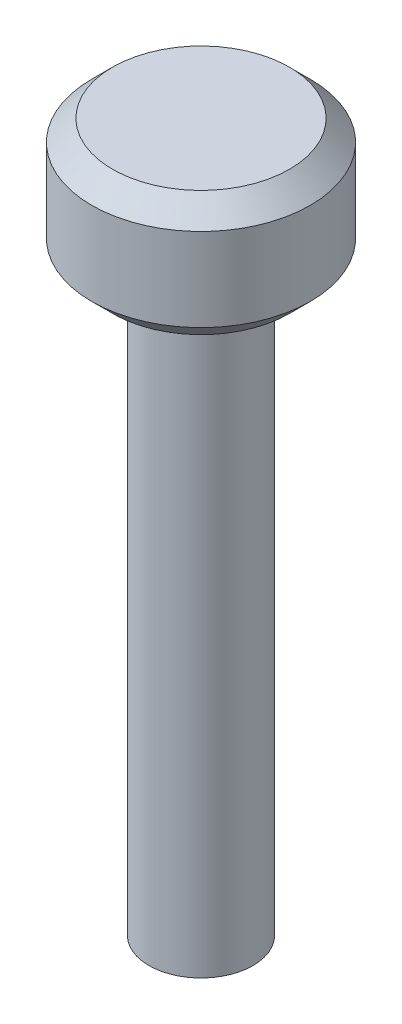
ISO-10303-21;
HEADER;
FILE_DESCRIPTION(('STEP AP214'),'2;1');
FILE_NAME('part.step','',(''),(''),'','','');
FILE_SCHEMA(('AUTOMOTIVE_DESIGN { 1 0 10303 214 1 1 1 1 }'));
ENDSEC;
DATA;
#1=APPLICATION_CONTEXT('core data for automotive mechanical design processes');
#2=APPLICATION_PROTOCOL_DEFINITION('international standard','automotive_design',2000,#1);
#3=PRODUCT_CONTEXT('',#1,'mechanical');
#4=PRODUCT('Part','Part','',(#3));
#5=PRODUCT_RELATED_PRODUCT_CATEGORY('part','',(#4));
#6=PRODUCT_DEFINITION_FORMATION('','',#4);
#7=PRODUCT_DEFINITION_CONTEXT('part definition',#1,'design');
#8=PRODUCT_DEFINITION('design','',#6,#7);
#9=PRODUCT_DEFINITION_SHAPE('','',#8);
#10=(LENGTH_UNIT() NAMED_UNIT(*) SI_UNIT(.MILLI.,.METRE.));
#11=(NAMED_UNIT(*) PLANE_ANGLE_UNIT() SI_UNIT($,.RADIAN.));
#12=(NAMED_UNIT(*) SI_UNIT($,.STERADIAN.) SOLID_ANGLE_UNIT());
#13=UNCERTAINTY_MEASURE_WITH_UNIT(LENGTH_MEASURE(1.E-05),#10,'distance_accuracy_value','');
#14=(GEOMETRIC_REPRESENTATION_CONTEXT(3) GLOBAL_UNCERTAINTY_ASSIGNED_CONTEXT((#13)) GLOBAL_UNIT_ASSIGNED_CONTEXT((#10,
#11,#12)) REPRESENTATION_CONTEXT('',''));
#15=CARTESIAN_POINT('',(0.,0.,0.));
#16=DIRECTION('',(0.,0.,1.));
#17=DIRECTION('',(1.,0.,0.));
#18=AXIS2_PLACEMENT_3D('',#15,#16,#17);
#19=CARTESIAN_POINT('',(0.,34.,0.));
#20=DIRECTION('',(0.,-1.,0.));
#21=DIRECTION('',(1.,0.,0.));
#22=AXIS2_PLACEMENT_3D('',#19,#20,#21);
#23=PLANE('',#22);
#24=CARTESIAN_POINT('',(0.,34.,0.));
#25=DIRECTION('',(0.,-1.,0.));
#26=DIRECTION('',(1.,0.,0.));
#27=AXIS2_PLACEMENT_3D('',#24,#25,#26);
#28=CIRCLE('',#27,4.25);
#29=CARTESIAN_POINT('',(4.25000000000001,34.,0.));
#30=VERTEX_POINT('',#29);
#31=EDGE_CURVE('E11',#30,#30,#28,.T.);
#32=ORIENTED_EDGE('',*,*,#31,.F.);
#33=EDGE_LOOP('',(#32));
#34=FACE_BOUND('',#33,.T.);
#35=ADVANCED_FACE('F43',(#34),#23,.F.);
#36=CARTESIAN_POINT('',(0.,34.,0.));
#37=DIRECTION('',(0.,-1.,0.));
#38=DIRECTION('',(1.,0.,0.));
#39=AXIS2_PLACEMENT_3D('',#36,#37,#38);
#40=CONICAL_SURFACE('',#39,4.25,0.785398163397448);
#41=CARTESIAN_POINT('',(0.,33.,0.));
#42=DIRECTION('',(0.,-1.,0.));
#43=DIRECTION('',(1.,0.,0.));
#44=AXIS2_PLACEMENT_3D('',#41,#42,#43);
#45=CIRCLE('',#44,5.25);
#46=CARTESIAN_POINT('',(5.25000000000001,33.,0.));
#47=VERTEX_POINT('',#46);
#48=EDGE_CURVE('E49',#47,#47,#45,.T.);
#49=ORIENTED_EDGE('',*,*,#48,.F.);
#50=EDGE_LOOP('',(#49));
#51=FACE_BOUND('',#50,.T.);
#52=ORIENTED_EDGE('',*,*,#31,.T.);
#53=EDGE_LOOP('',(#52));
#54=FACE_BOUND('',#53,.T.);
#55=ADVANCED_FACE('F76',(#51,#54),#40,.T.);
#56=CARTESIAN_POINT('',(0.,0.295692583709366,0.));
#57=DIRECTION('',(0.,-1.,0.));
#58=DIRECTION('',(1.,0.,0.));
#59=AXIS2_PLACEMENT_3D('',#56,#57,#58);
#60=CYLINDRICAL_SURFACE('',#59,5.25);
#61=CARTESIAN_POINT('',(0.,29.,0.));
#62=DIRECTION('',(0.,-1.,0.));
#63=DIRECTION('',(1.,0.,0.));
#64=AXIS2_PLACEMENT_3D('',#61,#62,#63);
#65=CIRCLE('',#64,5.25);
#66=CARTESIAN_POINT('',(5.25,29.,0.));
#67=VERTEX_POINT('',#66);
#68=EDGE_CURVE('E69',#67,#67,#65,.T.);
#69=ORIENTED_EDGE('',*,*,#68,.F.);
#70=EDGE_LOOP('',(#69));
#71=FACE_BOUND('',#70,.T.);
#72=ORIENTED_EDGE('',*,*,#48,.T.);
#73=EDGE_LOOP('',(#72));
#74=FACE_BOUND('',#73,.T.);
#75=ADVANCED_FACE('F74',(#71,#74),#60,.T.);
#76=CARTESIAN_POINT('',(0.,29.,0.));
#77=DIRECTION('',(0.,1.,0.));
#78=DIRECTION('',(-1.,0.,0.));
#79=AXIS2_PLACEMENT_3D('',#76,#77,#78);
#80=CONICAL_SURFACE('',#79,5.25,0.785398163397448);
#81=CARTESIAN_POINT('',(0.,28.,0.));
#82=DIRECTION('',(0.,-1.,0.));
#83=DIRECTION('',(1.,0.,0.));
#84=AXIS2_PLACEMENT_3D('',#81,#82,#83);
#85=CIRCLE('',#84,4.25);
#86=CARTESIAN_POINT('',(4.25,28.,0.));
#87=VERTEX_POINT('',#86);
#88=EDGE_CURVE('E64',#87,#87,#85,.T.);
#89=ORIENTED_EDGE('',*,*,#88,.F.);
#90=EDGE_LOOP('',(#89));
#91=FACE_BOUND('',#90,.T.);
#92=ORIENTED_EDGE('',*,*,#68,.T.);
#93=EDGE_LOOP('',(#92));
#94=FACE_BOUND('',#93,.T.);
#95=ADVANCED_FACE('F96',(#91,#94),#80,.T.);
#96=CARTESIAN_POINT('',(-4.25,28.,0.));
#97=DIRECTION('',(0.,1.,0.));
#98=DIRECTION('',(-1.,0.,0.));
#99=AXIS2_PLACEMENT_3D('',#96,#97,#98);
#100=PLANE('',#99);
#101=CARTESIAN_POINT('',(0.,28.,0.));
#102=DIRECTION('',(0.,-1.,0.));
#103=DIRECTION('',(1.,0.,0.));
#104=AXIS2_PLACEMENT_3D('',#101,#102,#103);
#105=CIRCLE('',#104,2.5);
#106=CARTESIAN_POINT('',(2.5,28.,0.));
#107=VERTEX_POINT('',#106);
#108=EDGE_CURVE('E61',#107,#107,#105,.T.);
#109=ORIENTED_EDGE('',*,*,#108,.F.);
#110=EDGE_LOOP('',(#109));
#111=FACE_BOUND('',#110,.T.);
#112=ORIENTED_EDGE('',*,*,#88,.T.);
#113=EDGE_LOOP('',(#112));
#114=FACE_BOUND('',#113,.T.);
#115=ADVANCED_FACE('F105',(#111,#114),#100,.F.);
#116=CARTESIAN_POINT('',(0.,0.295692583709366,0.));
#117=DIRECTION('',(0.,-1.,0.));
#118=DIRECTION('',(1.,0.,0.));
#119=AXIS2_PLACEMENT_3D('',#116,#117,#118);
#120=CYLINDRICAL_SURFACE('',#119,2.5);
#121=CARTESIAN_POINT('',(0.,0.,0.));
#122=DIRECTION('',(0.,-1.,0.));
#123=DIRECTION('',(1.,0.,0.));
#124=AXIS2_PLACEMENT_3D('',#121,#122,#123);
#125=CIRCLE('',#124,2.49999999999999);
#126=CARTESIAN_POINT('',(2.49999999999999,0.,0.));
#127=VERTEX_POINT('',#126);
#128=EDGE_CURVE('E59',#127,#127,#125,.T.);
#129=ORIENTED_EDGE('',*,*,#128,.F.);
#130=EDGE_LOOP('',(#129));
#131=FACE_BOUND('',#130,.T.);
#132=ORIENTED_EDGE('',*,*,#108,.T.);
#133=EDGE_LOOP('',(#132));
#134=FACE_BOUND('',#133,.T.);
#135=ADVANCED_FACE('F55',(#131,#134),#120,.T.);
#136=CARTESIAN_POINT('',(0.,0.,0.));
#137=DIRECTION('',(0.,-1.,0.));
#138=DIRECTION('',(1.,0.,0.));
#139=AXIS2_PLACEMENT_3D('',#136,#137,#138);
#140=CONICAL_SURFACE('',#139,2.49999999999999,1.45306625340535);
#141=CARTESIAN_POINT('',(0.,0.295692583709366,0.));
#142=VERTEX_POINT('',#141);
#143=VERTEX_LOOP('',#142);
#144=FACE_BOUND('',#143,.T.);
#145=ORIENTED_EDGE('',*,*,#128,.T.);
#146=EDGE_LOOP('',(#145));
#147=FACE_BOUND('',#146,.T.);
#148=ADVANCED_FACE('F52',(#144,#147),#140,.F.);
#149=CLOSED_SHELL('',(#35,#55,#75,#95,#115,#135,#148));
#150=MANIFOLD_SOLID_BREP('B2',#149);
#151=ADVANCED_BREP_SHAPE_REPRESENTATION('',(#18,#150),#14);
#152=SHAPE_DEFINITION_REPRESENTATION(#9,#151);
ENDSEC;
END-ISO-10303-21;
